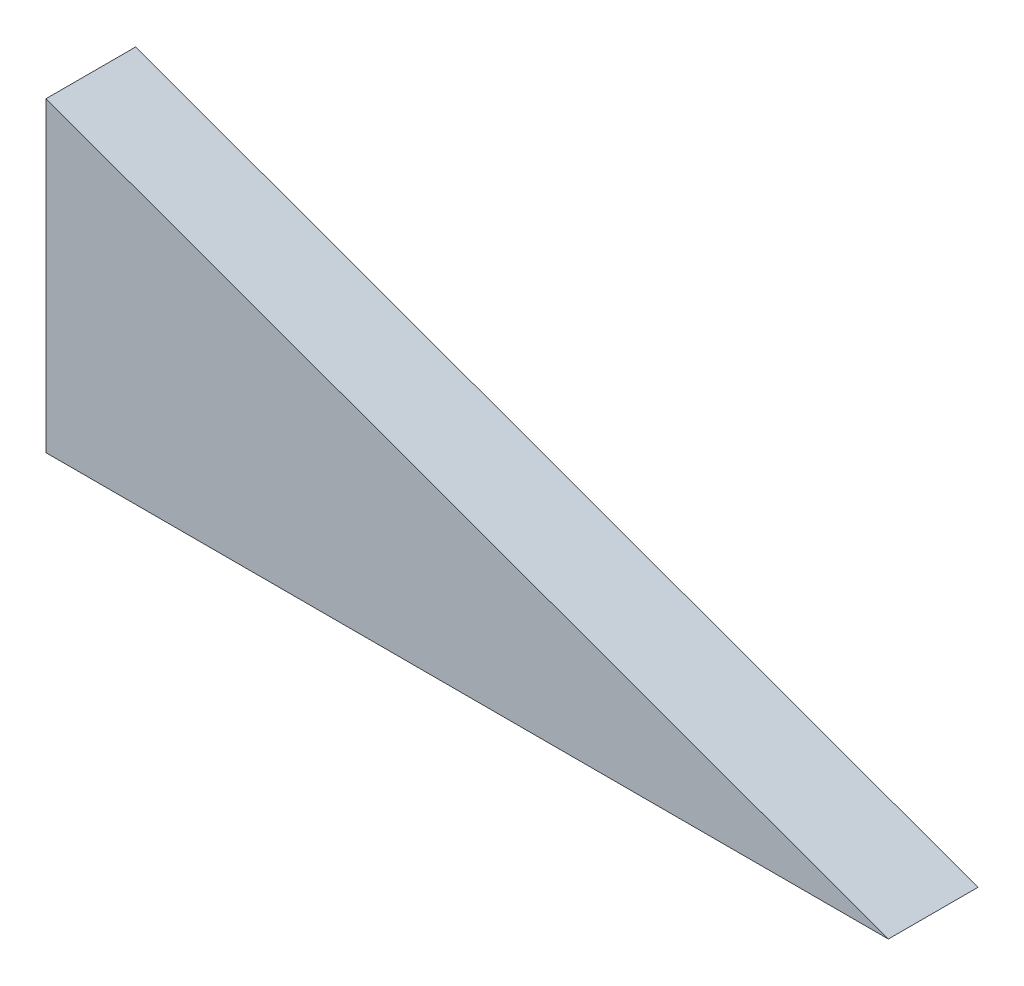
ISO-10303-21;
HEADER;
FILE_DESCRIPTION(('STEP AP214'),'2;1');
FILE_NAME('part.step','',(''),(''),'','','');
FILE_SCHEMA(('AUTOMOTIVE_DESIGN { 1 0 10303 214 1 1 1 1 }'));
ENDSEC;
DATA;
#1=APPLICATION_CONTEXT('core data for automotive mechanical design processes');
#2=APPLICATION_PROTOCOL_DEFINITION('international standard','automotive_design',2000,#1);
#3=PRODUCT_CONTEXT('',#1,'mechanical');
#4=PRODUCT('Part','Part','',(#3));
#5=PRODUCT_RELATED_PRODUCT_CATEGORY('part','',(#4));
#6=PRODUCT_DEFINITION_FORMATION('','',#4);
#7=PRODUCT_DEFINITION_CONTEXT('part definition',#1,'design');
#8=PRODUCT_DEFINITION('design','',#6,#7);
#9=PRODUCT_DEFINITION_SHAPE('','',#8);
#10=(LENGTH_UNIT() NAMED_UNIT(*) SI_UNIT(.MILLI.,.METRE.));
#11=(NAMED_UNIT(*) PLANE_ANGLE_UNIT() SI_UNIT($,.RADIAN.));
#12=(NAMED_UNIT(*) SI_UNIT($,.STERADIAN.) SOLID_ANGLE_UNIT());
#13=UNCERTAINTY_MEASURE_WITH_UNIT(LENGTH_MEASURE(1.E-05),#10,'distance_accuracy_value','');
#14=(GEOMETRIC_REPRESENTATION_CONTEXT(3) GLOBAL_UNCERTAINTY_ASSIGNED_CONTEXT((#13)) GLOBAL_UNIT_ASSIGNED_CONTEXT((#10,
#11,#12)) REPRESENTATION_CONTEXT('',''));
#15=CARTESIAN_POINT('',(0.,0.,0.));
#16=DIRECTION('',(0.,0.,1.));
#17=DIRECTION('',(1.,0.,0.));
#18=AXIS2_PLACEMENT_3D('',#15,#16,#17);
#19=CARTESIAN_POINT('',(-101.345686195653,-3.928856152513,5.));
#20=DIRECTION('',(1.,0.,0.));
#21=DIRECTION('',(0.,0.,-1.));
#22=AXIS2_PLACEMENT_3D('',#19,#20,#21);
#23=PLANE('',#22);
#24=DIRECTION('',(0.,-1.,0.));
#25=VECTOR('',#24,1.);
#26=CARTESIAN_POINT('',(-101.345686195653,-3.928856152513,0.));
#27=LINE('',#26,#25);
#28=CARTESIAN_POINT('',(-101.345686195653,-3.928856152513,0.));
#29=VERTEX_POINT('',#28);
#30=CARTESIAN_POINT('',(-101.345686195653,-21.0298633187961,0.));
#31=VERTEX_POINT('',#30);
#32=EDGE_CURVE('E80',#29,#31,#27,.T.);
#33=ORIENTED_EDGE('',*,*,#32,.T.);
#34=DIRECTION('',(0.,0.,-1.));
#35=VECTOR('',#34,1.);
#36=CARTESIAN_POINT('',(-101.345686195653,-21.0298633187961,5.));
#37=LINE('',#36,#35);
#38=CARTESIAN_POINT('',(-101.345686195653,-21.0298633187961,5.));
#39=VERTEX_POINT('',#38);
#40=EDGE_CURVE('E11',#39,#31,#37,.T.);
#41=ORIENTED_EDGE('',*,*,#40,.F.);
#42=DIRECTION('',(0.,-1.,0.));
#43=VECTOR('',#42,1.);
#44=CARTESIAN_POINT('',(-101.345686195653,-3.928856152513,5.));
#45=LINE('',#44,#43);
#46=CARTESIAN_POINT('',(-101.345686195653,-3.928856152513,5.));
#47=VERTEX_POINT('',#46);
#48=EDGE_CURVE('E73',#47,#39,#45,.T.);
#49=ORIENTED_EDGE('',*,*,#48,.F.);
#50=DIRECTION('',(0.,0.,-1.));
#51=VECTOR('',#50,1.);
#52=CARTESIAN_POINT('',(-101.345686195653,-3.928856152513,5.));
#53=LINE('',#52,#51);
#54=EDGE_CURVE('E81',#47,#29,#53,.T.);
#55=ORIENTED_EDGE('',*,*,#54,.T.);
#56=EDGE_LOOP('',(#33,#41,#49,#55));
#57=FACE_BOUND('',#56,.T.);
#58=ADVANCED_FACE('F33',(#57),#23,.F.);
#59=CARTESIAN_POINT('',(-101.345686195653,-21.0298633187961,5.));
#60=DIRECTION('',(0.,1.,0.));
#61=DIRECTION('',(0.,0.,1.));
#62=AXIS2_PLACEMENT_3D('',#59,#60,#61);
#63=PLANE('',#62);
#64=DIRECTION('',(1.,0.,0.));
#65=VECTOR('',#64,1.);
#66=CARTESIAN_POINT('',(-101.345686195653,-21.0298633187961,0.));
#67=LINE('',#66,#65);
#68=CARTESIAN_POINT('',(-54.361055156357,-21.0298633187961,0.));
#69=VERTEX_POINT('',#68);
#70=EDGE_CURVE('E61',#31,#69,#67,.T.);
#71=ORIENTED_EDGE('',*,*,#70,.T.);
#72=DIRECTION('',(0.,0.,-1.));
#73=VECTOR('',#72,1.);
#74=CARTESIAN_POINT('',(-54.361055156357,-21.0298633187961,5.));
#75=LINE('',#74,#73);
#76=CARTESIAN_POINT('',(-54.361055156357,-21.0298633187961,5.));
#77=VERTEX_POINT('',#76);
#78=EDGE_CURVE('E41',#77,#69,#75,.T.);
#79=ORIENTED_EDGE('',*,*,#78,.F.);
#80=DIRECTION('',(1.,0.,0.));
#81=VECTOR('',#80,1.);
#82=CARTESIAN_POINT('',(-101.345686195653,-21.0298633187961,5.));
#83=LINE('',#82,#81);
#84=EDGE_CURVE('E69',#39,#77,#83,.T.);
#85=ORIENTED_EDGE('',*,*,#84,.F.);
#86=ORIENTED_EDGE('',*,*,#40,.T.);
#87=EDGE_LOOP('',(#71,#79,#85,#86));
#88=FACE_BOUND('',#87,.T.);
#89=ADVANCED_FACE('F70',(#88),#63,.F.);
#90=CARTESIAN_POINT('',(-54.361055156357,-21.0298633187961,5.));
#91=DIRECTION('',(-0.342020143325663,-0.939692620785911,0.));
#92=DIRECTION('',(0.939692620785911,-0.342020143325663,0.));
#93=AXIS2_PLACEMENT_3D('',#90,#91,#92);
#94=PLANE('',#93);
#95=DIRECTION('',(-0.939692620785911,0.342020143325663,0.));
#96=VECTOR('',#95,1.);
#97=CARTESIAN_POINT('',(-54.361055156357,-21.0298633187961,0.));
#98=LINE('',#97,#96);
#99=EDGE_CURVE('E66',#69,#29,#98,.T.);
#100=ORIENTED_EDGE('',*,*,#99,.T.);
#101=ORIENTED_EDGE('',*,*,#54,.F.);
#102=DIRECTION('',(-0.939692620785911,0.342020143325663,0.));
#103=VECTOR('',#102,1.);
#104=CARTESIAN_POINT('',(-54.361055156357,-21.0298633187961,5.));
#105=LINE('',#104,#103);
#106=EDGE_CURVE('E49',#77,#47,#105,.T.);
#107=ORIENTED_EDGE('',*,*,#106,.F.);
#108=ORIENTED_EDGE('',*,*,#78,.T.);
#109=EDGE_LOOP('',(#100,#101,#107,#108));
#110=FACE_BOUND('',#109,.T.);
#111=ADVANCED_FACE('F88',(#110),#94,.F.);
#112=CARTESIAN_POINT('',(0.,0.,5.));
#113=DIRECTION('',(0.,0.,1.));
#114=DIRECTION('',(1.,0.,0.));
#115=AXIS2_PLACEMENT_3D('',#112,#113,#114);
#116=PLANE('',#115);
#117=ORIENTED_EDGE('',*,*,#48,.T.);
#118=ORIENTED_EDGE('',*,*,#84,.T.);
#119=ORIENTED_EDGE('',*,*,#106,.T.);
#120=EDGE_LOOP('',(#117,#118,#119));
#121=FACE_BOUND('',#120,.T.);
#122=ADVANCED_FACE('F76',(#121),#116,.T.);
#123=CARTESIAN_POINT('',(0.,0.,0.));
#124=DIRECTION('',(0.,0.,1.));
#125=DIRECTION('',(1.,0.,0.));
#126=AXIS2_PLACEMENT_3D('',#123,#124,#125);
#127=PLANE('',#126);
#128=ORIENTED_EDGE('',*,*,#32,.F.);
#129=ORIENTED_EDGE('',*,*,#99,.F.);
#130=ORIENTED_EDGE('',*,*,#70,.F.);
#131=EDGE_LOOP('',(#128,#129,#130));
#132=FACE_BOUND('',#131,.T.);
#133=ADVANCED_FACE('F89',(#132),#127,.F.);
#134=CLOSED_SHELL('',(#58,#89,#111,#122,#133));
#135=MANIFOLD_SOLID_BREP('B2',#134);
#136=ADVANCED_BREP_SHAPE_REPRESENTATION('',(#18,#135),#14);
#137=SHAPE_DEFINITION_REPRESENTATION(#9,#136);
ENDSEC;
END-ISO-10303-21;
